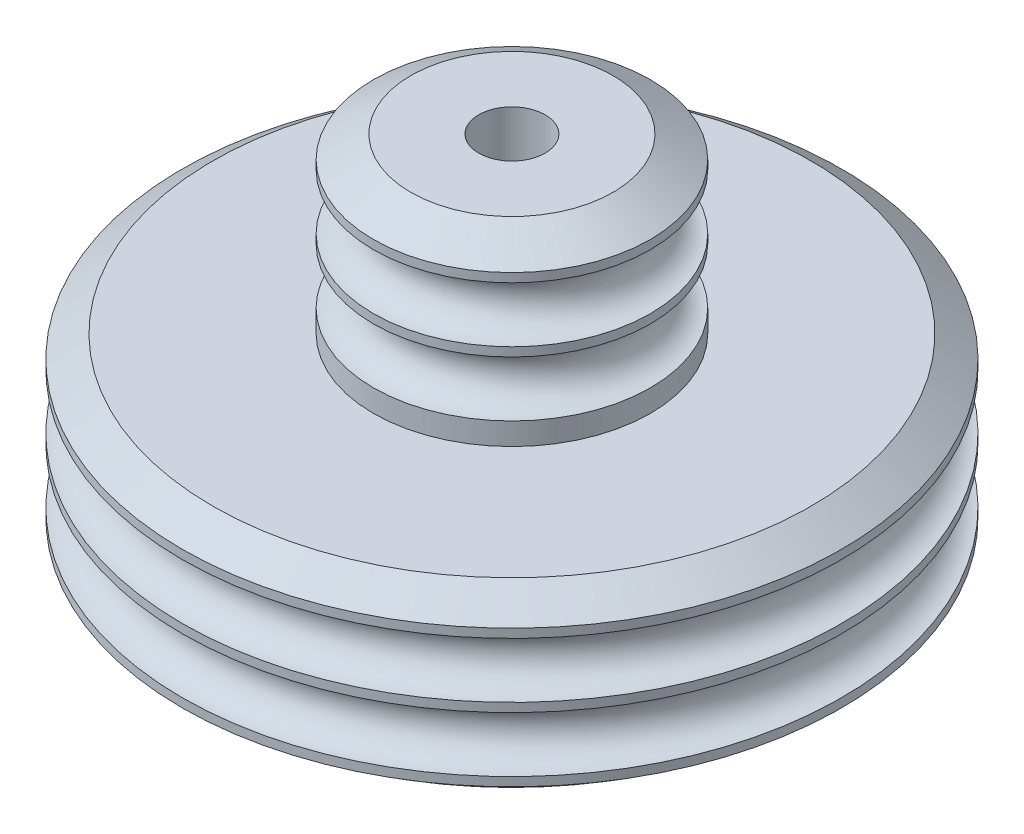
ISO-10303-21;
HEADER;
FILE_DESCRIPTION(('STEP AP214'),'2;1');
FILE_NAME('part.step','',(''),(''),'','','');
FILE_SCHEMA(('AUTOMOTIVE_DESIGN { 1 0 10303 214 1 1 1 1 }'));
ENDSEC;
DATA;
#1=APPLICATION_CONTEXT('core data for automotive mechanical design processes');
#2=APPLICATION_PROTOCOL_DEFINITION('international standard','automotive_design',2000,#1);
#3=PRODUCT_CONTEXT('',#1,'mechanical');
#4=PRODUCT('Part','Part','',(#3));
#5=PRODUCT_RELATED_PRODUCT_CATEGORY('part','',(#4));
#6=PRODUCT_DEFINITION_FORMATION('','',#4);
#7=PRODUCT_DEFINITION_CONTEXT('part definition',#1,'design');
#8=PRODUCT_DEFINITION('design','',#6,#7);
#9=PRODUCT_DEFINITION_SHAPE('','',#8);
#10=(LENGTH_UNIT() NAMED_UNIT(*) SI_UNIT(.MILLI.,.METRE.));
#11=(NAMED_UNIT(*) PLANE_ANGLE_UNIT() SI_UNIT($,.RADIAN.));
#12=(NAMED_UNIT(*) SI_UNIT($,.STERADIAN.) SOLID_ANGLE_UNIT());
#13=UNCERTAINTY_MEASURE_WITH_UNIT(LENGTH_MEASURE(1.E-05),#10,'distance_accuracy_value','');
#14=(GEOMETRIC_REPRESENTATION_CONTEXT(3) GLOBAL_UNCERTAINTY_ASSIGNED_CONTEXT((#13)) GLOBAL_UNIT_ASSIGNED_CONTEXT((#10,
#11,#12)) REPRESENTATION_CONTEXT('',''));
#15=CARTESIAN_POINT('',(0.,0.,0.));
#16=DIRECTION('',(0.,0.,1.));
#17=DIRECTION('',(1.,0.,0.));
#18=AXIS2_PLACEMENT_3D('',#15,#16,#17);
#19=CARTESIAN_POINT('',(0.,5.00732305137587,0.));
#20=DIRECTION('',(0.,1.,0.));
#21=DIRECTION('',(0.,0.,1.));
#22=AXIS2_PLACEMENT_3D('',#19,#20,#21);
#23=TOROIDAL_SURFACE('',#22,29.75,2.5);
#24=CARTESIAN_POINT('',(0.,2.50732305137587,0.));
#25=DIRECTION('',(0.,1.,0.));
#26=DIRECTION('',(0.,0.,1.));
#27=AXIS2_PLACEMENT_3D('',#24,#25,#26);
#28=CIRCLE('',#27,29.75);
#29=CARTESIAN_POINT('',(0.,2.50732305137587,29.75));
#30=VERTEX_POINT('',#29);
#31=EDGE_CURVE('E10',#30,#30,#28,.T.);
#32=ORIENTED_EDGE('',*,*,#31,.T.);
#33=EDGE_LOOP('',(#32));
#34=FACE_BOUND('',#33,.T.);
#35=CARTESIAN_POINT('',(0.,7.50732305137587,0.));
#36=DIRECTION('',(0.,1.,0.));
#37=DIRECTION('',(0.,0.,1.));
#38=AXIS2_PLACEMENT_3D('',#35,#36,#37);
#39=CIRCLE('',#38,29.75);
#40=CARTESIAN_POINT('',(0.,7.50732305137587,29.75));
#41=VERTEX_POINT('',#40);
#42=EDGE_CURVE('E98',#41,#41,#39,.T.);
#43=ORIENTED_EDGE('',*,*,#42,.F.);
#44=EDGE_LOOP('',(#43));
#45=FACE_BOUND('',#44,.T.);
#46=ADVANCED_FACE('F31',(#34,#45),#23,.F.);
#47=CARTESIAN_POINT('',(0.,20.8135182010223,0.));
#48=DIRECTION('',(0.,1.,0.));
#49=DIRECTION('',(0.,0.,1.));
#50=AXIS2_PLACEMENT_3D('',#47,#48,#49);
#51=CYLINDRICAL_SURFACE('',#50,29.75);
#52=CARTESIAN_POINT('',(0.,1.70732305137587,0.));
#53=DIRECTION('',(0.,1.,0.));
#54=DIRECTION('',(0.,0.,1.));
#55=AXIS2_PLACEMENT_3D('',#52,#53,#54);
#56=CIRCLE('',#55,29.75);
#57=CARTESIAN_POINT('',(0.,1.70732305137587,29.75));
#58=VERTEX_POINT('',#57);
#59=EDGE_CURVE('E37',#58,#58,#56,.T.);
#60=ORIENTED_EDGE('',*,*,#59,.T.);
#61=EDGE_LOOP('',(#60));
#62=FACE_BOUND('',#61,.T.);
#63=ORIENTED_EDGE('',*,*,#31,.F.);
#64=EDGE_LOOP('',(#63));
#65=FACE_BOUND('',#64,.T.);
#66=ADVANCED_FACE('F106',(#62,#65),#51,.T.);
#67=CARTESIAN_POINT('',(0.,1.70732305137587,0.));
#68=DIRECTION('',(0.,1.,0.));
#69=DIRECTION('',(0.,0.,1.));
#70=AXIS2_PLACEMENT_3D('',#67,#68,#69);
#71=CONICAL_SURFACE('',#70,29.75,0.942274330679715);
#72=CARTESIAN_POINT('',(0.,-0.292676948624129,0.));
#73=DIRECTION('',(0.,1.,0.));
#74=DIRECTION('',(0.,0.,1.));
#75=AXIS2_PLACEMENT_3D('',#72,#73,#74);
#76=CIRCLE('',#75,26.9984136608754);
#77=CARTESIAN_POINT('',(0.,-0.292676948624129,26.9984136608754));
#78=VERTEX_POINT('',#77);
#79=EDGE_CURVE('E41',#78,#78,#76,.T.);
#80=ORIENTED_EDGE('',*,*,#79,.T.);
#81=EDGE_LOOP('',(#80));
#82=FACE_BOUND('',#81,.T.);
#83=ORIENTED_EDGE('',*,*,#59,.F.);
#84=EDGE_LOOP('',(#83));
#85=FACE_BOUND('',#84,.T.);
#86=ADVANCED_FACE('F110',(#82,#85),#71,.T.);
#87=CARTESIAN_POINT('',(-23.9984136608754,-0.292676948624129,0.));
#88=DIRECTION('',(0.,-1.,0.));
#89=DIRECTION('',(0.,0.,-1.));
#90=AXIS2_PLACEMENT_3D('',#87,#88,#89);
#91=PLANE('',#90);
#92=CARTESIAN_POINT('',(0.,-0.292676948624129,0.));
#93=DIRECTION('',(0.,1.,0.));
#94=DIRECTION('',(0.,0.,1.));
#95=AXIS2_PLACEMENT_3D('',#92,#93,#94);
#96=CIRCLE('',#95,23.9984136608754);
#97=CARTESIAN_POINT('',(0.,-0.292676948624129,23.9984136608754));
#98=VERTEX_POINT('',#97);
#99=EDGE_CURVE('E45',#98,#98,#96,.T.);
#100=ORIENTED_EDGE('',*,*,#99,.T.);
#101=EDGE_LOOP('',(#100));
#102=FACE_BOUND('',#101,.T.);
#103=ORIENTED_EDGE('',*,*,#79,.F.);
#104=EDGE_LOOP('',(#103));
#105=FACE_BOUND('',#104,.T.);
#106=ADVANCED_FACE('F114',(#102,#105),#91,.T.);
#107=CARTESIAN_POINT('',(0.,-0.292676948624129,0.));
#108=DIRECTION('',(0.,-1.,0.));
#109=DIRECTION('',(0.,0.,-1.));
#110=AXIS2_PLACEMENT_3D('',#107,#108,#109);
#111=CONICAL_SURFACE('',#110,23.9984136608754,0.496218316602525);
#112=CARTESIAN_POINT('',(0.,5.70732305137587,0.));
#113=DIRECTION('',(0.,1.,0.));
#114=DIRECTION('',(0.,0.,1.));
#115=AXIS2_PLACEMENT_3D('',#112,#113,#114);
#116=CIRCLE('',#115,20.75);
#117=CARTESIAN_POINT('',(0.,5.70732305137587,20.75));
#118=VERTEX_POINT('',#117);
#119=EDGE_CURVE('E50',#118,#118,#116,.T.);
#120=ORIENTED_EDGE('',*,*,#119,.T.);
#121=EDGE_LOOP('',(#120));
#122=FACE_BOUND('',#121,.T.);
#123=ORIENTED_EDGE('',*,*,#99,.F.);
#124=EDGE_LOOP('',(#123));
#125=FACE_BOUND('',#124,.T.);
#126=ADVANCED_FACE('F121',(#122,#125),#111,.F.);
#127=CARTESIAN_POINT('',(-20.75,5.70732305137587,0.));
#128=DIRECTION('',(0.,-1.,0.));
#129=DIRECTION('',(0.,0.,-1.));
#130=AXIS2_PLACEMENT_3D('',#127,#128,#129);
#131=PLANE('',#130);
#132=CARTESIAN_POINT('',(0.,5.70732305137587,0.));
#133=DIRECTION('',(0.,1.,0.));
#134=DIRECTION('',(0.,0.,1.));
#135=AXIS2_PLACEMENT_3D('',#132,#133,#134);
#136=CIRCLE('',#135,15.75);
#137=CARTESIAN_POINT('',(0.,5.70732305137587,15.75));
#138=VERTEX_POINT('',#137);
#139=EDGE_CURVE('E53',#138,#138,#136,.T.);
#140=ORIENTED_EDGE('',*,*,#139,.T.);
#141=EDGE_LOOP('',(#140));
#142=FACE_BOUND('',#141,.T.);
#143=ORIENTED_EDGE('',*,*,#119,.F.);
#144=EDGE_LOOP('',(#143));
#145=FACE_BOUND('',#144,.T.);
#146=ADVANCED_FACE('F125',(#142,#145),#131,.T.);
#147=CARTESIAN_POINT('',(0.,5.70732305137587,0.));
#148=DIRECTION('',(0.,1.,0.));
#149=DIRECTION('',(0.,0.,1.));
#150=AXIS2_PLACEMENT_3D('',#147,#148,#149);
#151=CONICAL_SURFACE('',#150,15.75,0.496422753404882);
#152=CARTESIAN_POINT('',(0.,-0.292676948624129,0.));
#153=DIRECTION('',(0.,1.,0.));
#154=DIRECTION('',(0.,0.,1.));
#155=AXIS2_PLACEMENT_3D('',#152,#153,#154);
#156=CIRCLE('',#155,12.5);
#157=CARTESIAN_POINT('',(0.,-0.292676948624129,12.5));
#158=VERTEX_POINT('',#157);
#159=EDGE_CURVE('E56',#158,#158,#156,.T.);
#160=ORIENTED_EDGE('',*,*,#159,.T.);
#161=EDGE_LOOP('',(#160));
#162=FACE_BOUND('',#161,.T.);
#163=ORIENTED_EDGE('',*,*,#139,.F.);
#164=EDGE_LOOP('',(#163));
#165=FACE_BOUND('',#164,.T.);
#166=ADVANCED_FACE('F129',(#162,#165),#151,.T.);
#167=CARTESIAN_POINT('',(-3.,-0.292676948624129,0.));
#168=DIRECTION('',(0.,-1.,0.));
#169=DIRECTION('',(0.,0.,-1.));
#170=AXIS2_PLACEMENT_3D('',#167,#168,#169);
#171=PLANE('',#170);
#172=CARTESIAN_POINT('',(0.,-0.292676948624129,0.));
#173=DIRECTION('',(0.,1.,0.));
#174=DIRECTION('',(0.,0.,1.));
#175=AXIS2_PLACEMENT_3D('',#172,#173,#174);
#176=CIRCLE('',#175,3.);
#177=CARTESIAN_POINT('',(0.,-0.292676948624129,3.));
#178=VERTEX_POINT('',#177);
#179=EDGE_CURVE('E59',#178,#178,#176,.T.);
#180=ORIENTED_EDGE('',*,*,#179,.T.);
#181=EDGE_LOOP('',(#180));
#182=FACE_BOUND('',#181,.T.);
#183=ORIENTED_EDGE('',*,*,#159,.F.);
#184=EDGE_LOOP('',(#183));
#185=FACE_BOUND('',#184,.T.);
#186=ADVANCED_FACE('F133',(#182,#185),#171,.T.);
#187=CARTESIAN_POINT('',(0.,20.8135182010223,0.));
#188=DIRECTION('',(0.,1.,0.));
#189=DIRECTION('',(0.,0.,1.));
#190=AXIS2_PLACEMENT_3D('',#187,#188,#189);
#191=CYLINDRICAL_SURFACE('',#190,3.);
#192=CARTESIAN_POINT('',(0.,31.7073230513759,0.));
#193=DIRECTION('',(0.,1.,0.));
#194=DIRECTION('',(0.,0.,1.));
#195=AXIS2_PLACEMENT_3D('',#192,#193,#194);
#196=CIRCLE('',#195,3.);
#197=CARTESIAN_POINT('',(0.,31.7073230513759,3.));
#198=VERTEX_POINT('',#197);
#199=EDGE_CURVE('E62',#198,#198,#196,.T.);
#200=ORIENTED_EDGE('',*,*,#199,.T.);
#201=EDGE_LOOP('',(#200));
#202=FACE_BOUND('',#201,.T.);
#203=ORIENTED_EDGE('',*,*,#179,.F.);
#204=EDGE_LOOP('',(#203));
#205=FACE_BOUND('',#204,.T.);
#206=ADVANCED_FACE('F137',(#202,#205),#191,.F.);
#207=CARTESIAN_POINT('',(-9.1318590578616,31.7073230513759,0.));
#208=DIRECTION('',(0.,1.,0.));
#209=DIRECTION('',(0.,0.,1.));
#210=AXIS2_PLACEMENT_3D('',#207,#208,#209);
#211=PLANE('',#210);
#212=CARTESIAN_POINT('',(0.,31.7073230513759,0.));
#213=DIRECTION('',(0.,1.,0.));
#214=DIRECTION('',(0.,0.,1.));
#215=AXIS2_PLACEMENT_3D('',#212,#213,#214);
#216=CIRCLE('',#215,9.1318590578616);
#217=CARTESIAN_POINT('',(0.,31.7073230513759,9.1318590578616));
#218=VERTEX_POINT('',#217);
#219=EDGE_CURVE('E65',#218,#218,#216,.T.);
#220=ORIENTED_EDGE('',*,*,#219,.T.);
#221=EDGE_LOOP('',(#220));
#222=FACE_BOUND('',#221,.T.);
#223=ORIENTED_EDGE('',*,*,#199,.F.);
#224=EDGE_LOOP('',(#223));
#225=FACE_BOUND('',#224,.T.);
#226=ADVANCED_FACE('F141',(#222,#225),#211,.T.);
#227=CARTESIAN_POINT('',(0.,31.7073230513759,0.));
#228=DIRECTION('',(0.,-1.,0.));
#229=DIRECTION('',(0.,0.,-1.));
#230=AXIS2_PLACEMENT_3D('',#227,#228,#229);
#231=CONICAL_SURFACE('',#230,9.1318590578616,1.03494858121512);
#232=CARTESIAN_POINT('',(0.,29.7073230513759,0.));
#233=DIRECTION('',(0.,1.,0.));
#234=DIRECTION('',(0.,0.,1.));
#235=AXIS2_PLACEMENT_3D('',#232,#233,#234);
#236=CIRCLE('',#235,12.5);
#237=CARTESIAN_POINT('',(0.,29.7073230513759,12.5));
#238=VERTEX_POINT('',#237);
#239=EDGE_CURVE('E68',#238,#238,#236,.T.);
#240=ORIENTED_EDGE('',*,*,#239,.T.);
#241=EDGE_LOOP('',(#240));
#242=FACE_BOUND('',#241,.T.);
#243=ORIENTED_EDGE('',*,*,#219,.F.);
#244=EDGE_LOOP('',(#243));
#245=FACE_BOUND('',#244,.T.);
#246=ADVANCED_FACE('F145',(#242,#245),#231,.T.);
#247=CARTESIAN_POINT('',(0.,20.8135182010223,0.));
#248=DIRECTION('',(0.,1.,0.));
#249=DIRECTION('',(0.,0.,1.));
#250=AXIS2_PLACEMENT_3D('',#247,#248,#249);
#251=CYLINDRICAL_SURFACE('',#250,12.5);
#252=CARTESIAN_POINT('',(0.,28.9073230513759,0.));
#253=DIRECTION('',(0.,1.,0.));
#254=DIRECTION('',(0.,0.,1.));
#255=AXIS2_PLACEMENT_3D('',#252,#253,#254);
#256=CIRCLE('',#255,12.5);
#257=CARTESIAN_POINT('',(0.,28.9073230513759,12.5));
#258=VERTEX_POINT('',#257);
#259=EDGE_CURVE('E71',#258,#258,#256,.T.);
#260=ORIENTED_EDGE('',*,*,#259,.T.);
#261=EDGE_LOOP('',(#260));
#262=FACE_BOUND('',#261,.T.);
#263=ORIENTED_EDGE('',*,*,#239,.F.);
#264=EDGE_LOOP('',(#263));
#265=FACE_BOUND('',#264,.T.);
#266=ADVANCED_FACE('F149',(#262,#265),#251,.T.);
#267=CARTESIAN_POINT('',(0.,26.4073230513759,0.));
#268=DIRECTION('',(0.,1.,0.));
#269=DIRECTION('',(0.,0.,1.));
#270=AXIS2_PLACEMENT_3D('',#267,#268,#269);
#271=TOROIDAL_SURFACE('',#270,12.5,2.5);
#272=CARTESIAN_POINT('',(0.,23.9073230513759,0.));
#273=DIRECTION('',(0.,1.,0.));
#274=DIRECTION('',(0.,0.,1.));
#275=AXIS2_PLACEMENT_3D('',#272,#273,#274);
#276=CIRCLE('',#275,12.5);
#277=CARTESIAN_POINT('',(0.,23.9073230513759,12.5));
#278=VERTEX_POINT('',#277);
#279=EDGE_CURVE('E74',#278,#278,#276,.T.);
#280=ORIENTED_EDGE('',*,*,#279,.T.);
#281=EDGE_LOOP('',(#280));
#282=FACE_BOUND('',#281,.T.);
#283=ORIENTED_EDGE('',*,*,#259,.F.);
#284=EDGE_LOOP('',(#283));
#285=FACE_BOUND('',#284,.T.);
#286=ADVANCED_FACE('F153',(#282,#285),#271,.F.);
#287=CARTESIAN_POINT('',(0.,20.8135182010223,0.));
#288=DIRECTION('',(0.,1.,0.));
#289=DIRECTION('',(0.,0.,1.));
#290=AXIS2_PLACEMENT_3D('',#287,#288,#289);
#291=CYLINDRICAL_SURFACE('',#290,12.5);
#292=CARTESIAN_POINT('',(0.,23.1073230513759,0.));
#293=DIRECTION('',(0.,1.,0.));
#294=DIRECTION('',(0.,0.,1.));
#295=AXIS2_PLACEMENT_3D('',#292,#293,#294);
#296=CIRCLE('',#295,12.5);
#297=CARTESIAN_POINT('',(0.,23.1073230513759,12.5));
#298=VERTEX_POINT('',#297);
#299=EDGE_CURVE('E77',#298,#298,#296,.T.);
#300=ORIENTED_EDGE('',*,*,#299,.T.);
#301=EDGE_LOOP('',(#300));
#302=FACE_BOUND('',#301,.T.);
#303=ORIENTED_EDGE('',*,*,#279,.F.);
#304=EDGE_LOOP('',(#303));
#305=FACE_BOUND('',#304,.T.);
#306=ADVANCED_FACE('F157',(#302,#305),#291,.T.);
#307=CARTESIAN_POINT('',(0.,20.6073230513759,0.));
#308=DIRECTION('',(0.,1.,0.));
#309=DIRECTION('',(0.,0.,1.));
#310=AXIS2_PLACEMENT_3D('',#307,#308,#309);
#311=TOROIDAL_SURFACE('',#310,12.5,2.5);
#312=CARTESIAN_POINT('',(0.,18.1073230513759,0.));
#313=DIRECTION('',(0.,1.,0.));
#314=DIRECTION('',(0.,0.,1.));
#315=AXIS2_PLACEMENT_3D('',#312,#313,#314);
#316=CIRCLE('',#315,12.5);
#317=CARTESIAN_POINT('',(0.,18.1073230513759,12.5));
#318=VERTEX_POINT('',#317);
#319=EDGE_CURVE('E80',#318,#318,#316,.T.);
#320=ORIENTED_EDGE('',*,*,#319,.T.);
#321=EDGE_LOOP('',(#320));
#322=FACE_BOUND('',#321,.T.);
#323=ORIENTED_EDGE('',*,*,#299,.F.);
#324=EDGE_LOOP('',(#323));
#325=FACE_BOUND('',#324,.T.);
#326=ADVANCED_FACE('F161',(#322,#325),#311,.F.);
#327=CARTESIAN_POINT('',(0.,20.8135182010223,0.));
#328=DIRECTION('',(0.,1.,0.));
#329=DIRECTION('',(0.,0.,1.));
#330=AXIS2_PLACEMENT_3D('',#327,#328,#329);
#331=CYLINDRICAL_SURFACE('',#330,12.5);
#332=CARTESIAN_POINT('',(0.,16.1073230513759,0.));
#333=DIRECTION('',(0.,1.,0.));
#334=DIRECTION('',(0.,0.,1.));
#335=AXIS2_PLACEMENT_3D('',#332,#333,#334);
#336=CIRCLE('',#335,12.5);
#337=CARTESIAN_POINT('',(0.,16.1073230513759,12.5));
#338=VERTEX_POINT('',#337);
#339=EDGE_CURVE('E83',#338,#338,#336,.T.);
#340=ORIENTED_EDGE('',*,*,#339,.T.);
#341=EDGE_LOOP('',(#340));
#342=FACE_BOUND('',#341,.T.);
#343=ORIENTED_EDGE('',*,*,#319,.F.);
#344=EDGE_LOOP('',(#343));
#345=FACE_BOUND('',#344,.T.);
#346=ADVANCED_FACE('F165',(#342,#345),#331,.T.);
#347=CARTESIAN_POINT('',(-27.,16.1073230513759,0.));
#348=DIRECTION('',(0.,1.,0.));
#349=DIRECTION('',(0.,0.,1.));
#350=AXIS2_PLACEMENT_3D('',#347,#348,#349);
#351=PLANE('',#350);
#352=CARTESIAN_POINT('',(0.,16.1073230513759,0.));
#353=DIRECTION('',(0.,1.,0.));
#354=DIRECTION('',(0.,0.,1.));
#355=AXIS2_PLACEMENT_3D('',#352,#353,#354);
#356=CIRCLE('',#355,27.);
#357=CARTESIAN_POINT('',(0.,16.1073230513759,27.));
#358=VERTEX_POINT('',#357);
#359=EDGE_CURVE('E86',#358,#358,#356,.T.);
#360=ORIENTED_EDGE('',*,*,#359,.T.);
#361=EDGE_LOOP('',(#360));
#362=FACE_BOUND('',#361,.T.);
#363=ORIENTED_EDGE('',*,*,#339,.F.);
#364=EDGE_LOOP('',(#363));
#365=FACE_BOUND('',#364,.T.);
#366=ADVANCED_FACE('F169',(#362,#365),#351,.T.);
#367=CARTESIAN_POINT('',(0.,16.1073230513759,0.));
#368=DIRECTION('',(0.,-1.,0.));
#369=DIRECTION('',(0.,0.,-1.));
#370=AXIS2_PLACEMENT_3D('',#367,#368,#369);
#371=CONICAL_SURFACE('',#370,27.,0.942000040379462);
#372=CARTESIAN_POINT('',(0.,14.1073230513759,0.));
#373=DIRECTION('',(0.,1.,0.));
#374=DIRECTION('',(0.,0.,1.));
#375=AXIS2_PLACEMENT_3D('',#372,#373,#374);
#376=CIRCLE('',#375,29.75);
#377=CARTESIAN_POINT('',(0.,14.1073230513759,29.75));
#378=VERTEX_POINT('',#377);
#379=EDGE_CURVE('E89',#378,#378,#376,.T.);
#380=ORIENTED_EDGE('',*,*,#379,.T.);
#381=EDGE_LOOP('',(#380));
#382=FACE_BOUND('',#381,.T.);
#383=ORIENTED_EDGE('',*,*,#359,.F.);
#384=EDGE_LOOP('',(#383));
#385=FACE_BOUND('',#384,.T.);
#386=ADVANCED_FACE('F173',(#382,#385),#371,.T.);
#387=CARTESIAN_POINT('',(0.,20.8135182010223,0.));
#388=DIRECTION('',(0.,1.,0.));
#389=DIRECTION('',(0.,0.,1.));
#390=AXIS2_PLACEMENT_3D('',#387,#388,#389);
#391=CYLINDRICAL_SURFACE('',#390,29.75);
#392=CARTESIAN_POINT('',(0.,13.3073230513759,0.));
#393=DIRECTION('',(0.,1.,0.));
#394=DIRECTION('',(0.,0.,1.));
#395=AXIS2_PLACEMENT_3D('',#392,#393,#394);
#396=CIRCLE('',#395,29.75);
#397=CARTESIAN_POINT('',(0.,13.3073230513759,29.75));
#398=VERTEX_POINT('',#397);
#399=EDGE_CURVE('E92',#398,#398,#396,.T.);
#400=ORIENTED_EDGE('',*,*,#399,.T.);
#401=EDGE_LOOP('',(#400));
#402=FACE_BOUND('',#401,.T.);
#403=ORIENTED_EDGE('',*,*,#379,.F.);
#404=EDGE_LOOP('',(#403));
#405=FACE_BOUND('',#404,.T.);
#406=ADVANCED_FACE('F177',(#402,#405),#391,.T.);
#407=CARTESIAN_POINT('',(0.,10.8073230513759,0.));
#408=DIRECTION('',(0.,1.,0.));
#409=DIRECTION('',(0.,0.,1.));
#410=AXIS2_PLACEMENT_3D('',#407,#408,#409);
#411=TOROIDAL_SURFACE('',#410,29.75,2.5);
#412=CARTESIAN_POINT('',(0.,8.30732305137587,0.));
#413=DIRECTION('',(0.,1.,0.));
#414=DIRECTION('',(0.,0.,1.));
#415=AXIS2_PLACEMENT_3D('',#412,#413,#414);
#416=CIRCLE('',#415,29.75);
#417=CARTESIAN_POINT('',(0.,8.30732305137587,29.75));
#418=VERTEX_POINT('',#417);
#419=EDGE_CURVE('E95',#418,#418,#416,.T.);
#420=ORIENTED_EDGE('',*,*,#419,.T.);
#421=EDGE_LOOP('',(#420));
#422=FACE_BOUND('',#421,.T.);
#423=ORIENTED_EDGE('',*,*,#399,.F.);
#424=EDGE_LOOP('',(#423));
#425=FACE_BOUND('',#424,.T.);
#426=ADVANCED_FACE('F181',(#422,#425),#411,.F.);
#427=CARTESIAN_POINT('',(0.,20.8135182010223,0.));
#428=DIRECTION('',(0.,1.,0.));
#429=DIRECTION('',(0.,0.,1.));
#430=AXIS2_PLACEMENT_3D('',#427,#428,#429);
#431=CYLINDRICAL_SURFACE('',#430,29.75);
#432=ORIENTED_EDGE('',*,*,#42,.T.);
#433=EDGE_LOOP('',(#432));
#434=FACE_BOUND('',#433,.T.);
#435=ORIENTED_EDGE('',*,*,#419,.F.);
#436=EDGE_LOOP('',(#435));
#437=FACE_BOUND('',#436,.T.);
#438=ADVANCED_FACE('F102',(#434,#437),#431,.T.);
#439=CLOSED_SHELL('',(#46,#66,#86,#106,#126,#146,#166,#186,#206,#226,#246,#266,#286,#306,#326,
#346,#366,#386,#406,#426,#438));
#440=MANIFOLD_SOLID_BREP('B2',#439);
#441=ADVANCED_BREP_SHAPE_REPRESENTATION('',(#18,#440),#14);
#442=SHAPE_DEFINITION_REPRESENTATION(#9,#441);
ENDSEC;
END-ISO-10303-21;
